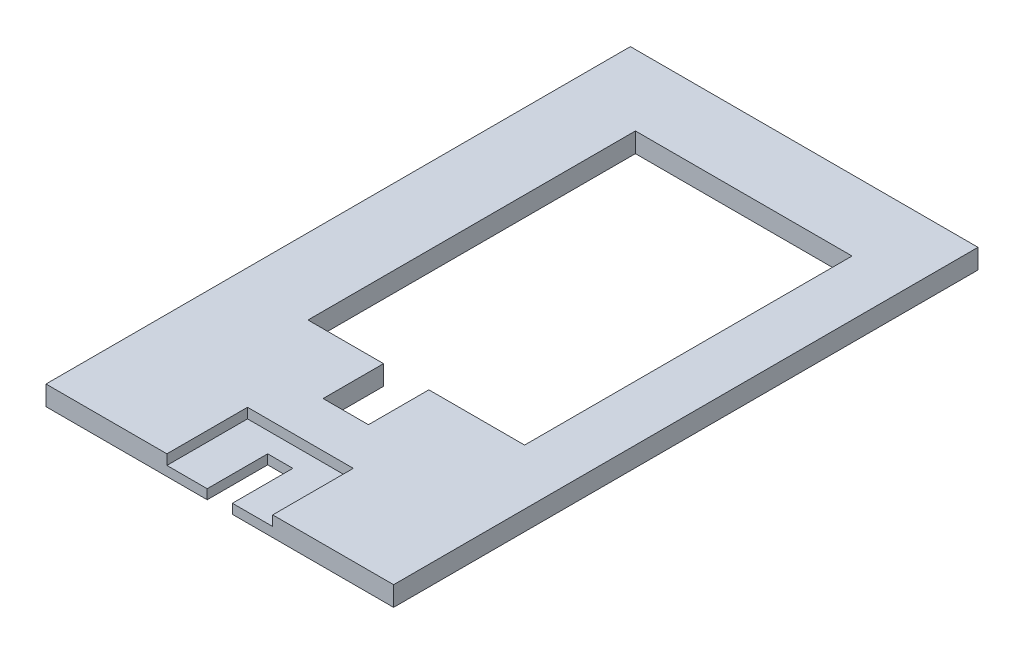
ISO-10303-21;
HEADER;
FILE_DESCRIPTION(('STEP AP214'),'2;1');
FILE_NAME('part.step','',(''),(''),'','','');
FILE_SCHEMA(('AUTOMOTIVE_DESIGN { 1 0 10303 214 1 1 1 1 }'));
ENDSEC;
DATA;
#1=APPLICATION_CONTEXT('core data for automotive mechanical design processes');
#2=APPLICATION_PROTOCOL_DEFINITION('international standard','automotive_design',2000,#1);
#3=PRODUCT_CONTEXT('',#1,'mechanical');
#4=PRODUCT('Part','Part','',(#3));
#5=PRODUCT_RELATED_PRODUCT_CATEGORY('part','',(#4));
#6=PRODUCT_DEFINITION_FORMATION('','',#4);
#7=PRODUCT_DEFINITION_CONTEXT('part definition',#1,'design');
#8=PRODUCT_DEFINITION('design','',#6,#7);
#9=PRODUCT_DEFINITION_SHAPE('','',#8);
#10=(LENGTH_UNIT() NAMED_UNIT(*) SI_UNIT(.MILLI.,.METRE.));
#11=(NAMED_UNIT(*) PLANE_ANGLE_UNIT() SI_UNIT($,.RADIAN.));
#12=(NAMED_UNIT(*) SI_UNIT($,.STERADIAN.) SOLID_ANGLE_UNIT());
#13=UNCERTAINTY_MEASURE_WITH_UNIT(LENGTH_MEASURE(1.E-05),#10,'distance_accuracy_value','');
#14=(GEOMETRIC_REPRESENTATION_CONTEXT(3) GLOBAL_UNCERTAINTY_ASSIGNED_CONTEXT((#13)) GLOBAL_UNIT_ASSIGNED_CONTEXT((#10,
#11,#12)) REPRESENTATION_CONTEXT('',''));
#15=CARTESIAN_POINT('',(0.,0.,0.));
#16=DIRECTION('',(0.,0.,1.));
#17=DIRECTION('',(1.,0.,0.));
#18=AXIS2_PLACEMENT_3D('',#15,#16,#17);
#19=CARTESIAN_POINT('',(187.572815533981,19.53,173.337378640777));
#20=DIRECTION('',(0.,0.,1.));
#21=DIRECTION('',(1.,0.,0.));
#22=AXIS2_PLACEMENT_3D('',#19,#20,#21);
#23=PLANE('',#22);
#24=DIRECTION('',(0.,1.,0.));
#25=VECTOR('',#24,1.);
#26=CARTESIAN_POINT('',(2.57281553398068,-0.469999999999998,173.337378640777));
#27=LINE('',#26,#25);
#28=CARTESIAN_POINT('',(2.57281553398068,0.,173.337378640777));
#29=VERTEX_POINT('',#28);
#30=CARTESIAN_POINT('',(2.57281553398068,9.53,173.337378640777));
#31=VERTEX_POINT('',#30);
#32=EDGE_CURVE('E174',#29,#31,#27,.T.);
#33=ORIENTED_EDGE('',*,*,#32,.T.);
#34=DIRECTION('',(1.,0.,0.));
#35=VECTOR('',#34,1.);
#36=CARTESIAN_POINT('',(-37.4271844660193,9.53,173.337378640777));
#37=LINE('',#36,#35);
#38=CARTESIAN_POINT('',(-37.4271844660193,9.53,173.337378640777));
#39=VERTEX_POINT('',#38);
#40=EDGE_CURVE('E186',#39,#31,#37,.T.);
#41=ORIENTED_EDGE('',*,*,#40,.F.);
#42=DIRECTION('',(0.,1.,0.));
#43=VECTOR('',#42,1.);
#44=CARTESIAN_POINT('',(-37.4271844660193,9.53,173.337378640777));
#45=LINE('',#44,#43);
#46=CARTESIAN_POINT('',(-37.4271844660193,19.53,173.337378640777));
#47=VERTEX_POINT('',#46);
#48=EDGE_CURVE('E202',#39,#47,#45,.T.);
#49=ORIENTED_EDGE('',*,*,#48,.T.);
#50=DIRECTION('',(-1.,0.,0.));
#51=VECTOR('',#50,1.);
#52=CARTESIAN_POINT('',(187.572815533981,19.53,173.337378640777));
#53=LINE('',#52,#51);
#54=CARTESIAN_POINT('',(-157.427184466019,19.53,173.337378640777));
#55=VERTEX_POINT('',#54);
#56=EDGE_CURVE('E290',#47,#55,#53,.T.);
#57=ORIENTED_EDGE('',*,*,#56,.T.);
#58=DIRECTION('',(0.,-1.,0.));
#59=VECTOR('',#58,1.);
#60=CARTESIAN_POINT('',(-157.427184466019,19.53,173.337378640777));
#61=LINE('',#60,#59);
#62=CARTESIAN_POINT('',(-157.427184466019,0.,173.337378640777));
#63=VERTEX_POINT('',#62);
#64=EDGE_CURVE('E306',#55,#63,#61,.T.);
#65=ORIENTED_EDGE('',*,*,#64,.T.);
#66=DIRECTION('',(-1.,0.,0.));
#67=VECTOR('',#66,1.);
#68=CARTESIAN_POINT('',(187.572815533981,0.,173.337378640777));
#69=LINE('',#68,#67);
#70=EDGE_CURVE('E188',#29,#63,#69,.T.);
#71=ORIENTED_EDGE('',*,*,#70,.F.);
#72=EDGE_LOOP('',(#33,#41,#49,#57,#65,#71));
#73=FACE_BOUND('',#72,.T.);
#74=ADVANCED_FACE('F32',(#73),#23,.T.);
#75=CARTESIAN_POINT('',(-82.4271844660193,19.530012,-11.6626213592233));
#76=DIRECTION('',(0.,0.,-1.));
#77=DIRECTION('',(-1.,0.,0.));
#78=AXIS2_PLACEMENT_3D('',#75,#76,#77);
#79=PLANE('',#78);
#80=DIRECTION('',(0.,1.,0.));
#81=VECTOR('',#80,1.);
#82=CARTESIAN_POINT('',(-7.42718446601934,0.,-11.6626213592233));
#83=LINE('',#82,#81);
#84=CARTESIAN_POINT('',(-7.42718446601934,0.,-11.6626213592233));
#85=VERTEX_POINT('',#84);
#86=CARTESIAN_POINT('',(-7.42718446601934,19.53,-11.6626213592233));
#87=VERTEX_POINT('',#86);
#88=EDGE_CURVE('E237',#85,#87,#83,.T.);
#89=ORIENTED_EDGE('',*,*,#88,.F.);
#90=DIRECTION('',(-1.,0.,0.));
#91=VECTOR('',#90,1.);
#92=CARTESIAN_POINT('',(-82.4271844660193,0.,-11.6626213592233));
#93=LINE('',#92,#91);
#94=CARTESIAN_POINT('',(-82.4271844660193,0.,-11.6626213592233));
#95=VERTEX_POINT('',#94);
#96=EDGE_CURVE('E253',#85,#95,#93,.T.);
#97=ORIENTED_EDGE('',*,*,#96,.T.);
#98=DIRECTION('',(0.,-1.,0.));
#99=VECTOR('',#98,1.);
#100=CARTESIAN_POINT('',(-82.4271844660193,19.530012,-11.6626213592233));
#101=LINE('',#100,#99);
#102=CARTESIAN_POINT('',(-82.4271844660193,19.53,-11.6626213592233));
#103=VERTEX_POINT('',#102);
#104=EDGE_CURVE('E264',#103,#95,#101,.T.);
#105=ORIENTED_EDGE('',*,*,#104,.F.);
#106=DIRECTION('',(-1.,0.,0.));
#107=VECTOR('',#106,1.);
#108=CARTESIAN_POINT('',(0.,19.53,-11.6626213592233));
#109=LINE('',#108,#107);
#110=EDGE_CURVE('E273',#87,#103,#109,.T.);
#111=ORIENTED_EDGE('',*,*,#110,.F.);
#112=EDGE_LOOP('',(#89,#97,#105,#111));
#113=FACE_BOUND('',#112,.T.);
#114=ADVANCED_FACE('F372',(#113),#79,.T.);
#115=CARTESIAN_POINT('',(0.,19.53,0.));
#116=DIRECTION('',(0.,1.,0.));
#117=DIRECTION('',(0.,0.,1.));
#118=AXIS2_PLACEMENT_3D('',#115,#116,#117);
#119=PLANE('',#118);
#120=DIRECTION('',(0.,0.,1.));
#121=VECTOR('',#120,1.);
#122=CARTESIAN_POINT('',(-37.4271844660193,19.53,93.3373786407766));
#123=LINE('',#122,#121);
#124=CARTESIAN_POINT('',(-37.4271844660193,19.53,93.3373786407766));
#125=VERTEX_POINT('',#124);
#126=EDGE_CURVE('E203',#125,#47,#123,.T.);
#127=ORIENTED_EDGE('',*,*,#126,.F.);
#128=DIRECTION('',(-1.,0.,0.));
#129=VECTOR('',#128,1.);
#130=CARTESIAN_POINT('',(-37.4271844660193,19.53,93.3373786407766));
#131=LINE('',#130,#129);
#132=CARTESIAN_POINT('',(67.5728155339806,19.53,93.3373786407766));
#133=VERTEX_POINT('',#132);
#134=EDGE_CURVE('E209',#133,#125,#131,.T.);
#135=ORIENTED_EDGE('',*,*,#134,.F.);
#136=DIRECTION('',(0.,0.,-1.));
#137=VECTOR('',#136,1.);
#138=CARTESIAN_POINT('',(67.5728155339806,19.53,93.3373786407766));
#139=LINE('',#138,#137);
#140=CARTESIAN_POINT('',(67.5728155339807,19.53,173.337378640777));
#141=VERTEX_POINT('',#140);
#142=EDGE_CURVE('E205',#141,#133,#139,.T.);
#143=ORIENTED_EDGE('',*,*,#142,.F.);
#144=CARTESIAN_POINT('',(187.572815533981,19.53,173.337378640777));
#145=VERTEX_POINT('',#144);
#146=EDGE_CURVE('E291',#145,#141,#53,.T.);
#147=ORIENTED_EDGE('',*,*,#146,.F.);
#148=DIRECTION('',(0.,0.,-1.));
#149=VECTOR('',#148,1.);
#150=CARTESIAN_POINT('',(187.572815533981,19.53,173.337378640777));
#151=LINE('',#150,#149);
#152=CARTESIAN_POINT('',(187.572815533981,19.53,-406.662621359223));
#153=VERTEX_POINT('',#152);
#154=EDGE_CURVE('E281',#145,#153,#151,.T.);
#155=ORIENTED_EDGE('',*,*,#154,.T.);
#156=DIRECTION('',(-1.,0.,0.));
#157=VECTOR('',#156,1.);
#158=CARTESIAN_POINT('',(187.572815533981,19.53,-406.662621359223));
#159=LINE('',#158,#157);
#160=CARTESIAN_POINT('',(-157.427184466019,19.53,-406.662621359223));
#161=VERTEX_POINT('',#160);
#162=EDGE_CURVE('E284',#153,#161,#159,.T.);
#163=ORIENTED_EDGE('',*,*,#162,.T.);
#164=DIRECTION('',(0.,0.,-1.));
#165=VECTOR('',#164,1.);
#166=CARTESIAN_POINT('',(-157.427184466019,19.53,173.337378640777));
#167=LINE('',#166,#165);
#168=EDGE_CURVE('E287',#55,#161,#167,.T.);
#169=ORIENTED_EDGE('',*,*,#168,.F.);
#170=ORIENTED_EDGE('',*,*,#56,.F.);
#171=EDGE_LOOP('',(#127,#135,#143,#147,#155,#163,#169,#170));
#172=FACE_BOUND('',#171,.T.);
#173=DIRECTION('',(0.,0.,1.));
#174=VECTOR('',#173,1.);
#175=CARTESIAN_POINT('',(-7.42718446601934,19.53,-11.6626213592233));
#176=LINE('',#175,#174);
#177=CARTESIAN_POINT('',(-7.42718446601933,19.53,48.3373786407767));
#178=VERTEX_POINT('',#177);
#179=EDGE_CURVE('E214',#87,#178,#176,.T.);
#180=ORIENTED_EDGE('',*,*,#179,.F.);
#181=ORIENTED_EDGE('',*,*,#110,.T.);
#182=DIRECTION('',(0.,0.,-1.));
#183=VECTOR('',#182,1.);
#184=CARTESIAN_POINT('',(-82.4271844660193,19.53,0.));
#185=LINE('',#184,#183);
#186=CARTESIAN_POINT('',(-82.4271844660193,19.53,-336.662621359223));
#187=VERTEX_POINT('',#186);
#188=EDGE_CURVE('E277',#103,#187,#185,.T.);
#189=ORIENTED_EDGE('',*,*,#188,.T.);
#190=DIRECTION('',(1.,0.,0.));
#191=VECTOR('',#190,1.);
#192=CARTESIAN_POINT('',(0.,19.53,-336.662621359223));
#193=LINE('',#192,#191);
#194=CARTESIAN_POINT('',(132.572815533981,19.53,-336.662621359223));
#195=VERTEX_POINT('',#194);
#196=EDGE_CURVE('E267',#187,#195,#193,.T.);
#197=ORIENTED_EDGE('',*,*,#196,.T.);
#198=DIRECTION('',(0.,0.,1.));
#199=VECTOR('',#198,1.);
#200=CARTESIAN_POINT('',(132.572815533981,19.53,0.));
#201=LINE('',#200,#199);
#202=CARTESIAN_POINT('',(132.572815533981,19.53,-11.6626213592233));
#203=VERTEX_POINT('',#202);
#204=EDGE_CURVE('E270',#195,#203,#201,.T.);
#205=ORIENTED_EDGE('',*,*,#204,.T.);
#206=CARTESIAN_POINT('',(37.5728155339806,19.53,-11.6626213592233));
#207=VERTEX_POINT('',#206);
#208=EDGE_CURVE('E274',#203,#207,#109,.T.);
#209=ORIENTED_EDGE('',*,*,#208,.T.);
#210=DIRECTION('',(0.,0.,-1.));
#211=VECTOR('',#210,1.);
#212=CARTESIAN_POINT('',(37.5728155339806,19.53,-11.6626213592233));
#213=LINE('',#212,#211);
#214=CARTESIAN_POINT('',(37.5728155339807,19.53,48.3373786407767));
#215=VERTEX_POINT('',#214);
#216=EDGE_CURVE('E224',#215,#207,#213,.T.);
#217=ORIENTED_EDGE('',*,*,#216,.F.);
#218=DIRECTION('',(1.,0.,0.));
#219=VECTOR('',#218,1.);
#220=CARTESIAN_POINT('',(-7.42718446601933,19.53,48.3373786407767));
#221=LINE('',#220,#219);
#222=EDGE_CURVE('E233',#178,#215,#221,.T.);
#223=ORIENTED_EDGE('',*,*,#222,.F.);
#224=EDGE_LOOP('',(#180,#181,#189,#197,#205,#209,#217,#223));
#225=FACE_BOUND('',#224,.T.);
#226=ADVANCED_FACE('F323',(#172,#225),#119,.T.);
#227=CARTESIAN_POINT('',(0.,0.,0.));
#228=DIRECTION('',(0.,1.,0.));
#229=DIRECTION('',(0.,0.,1.));
#230=AXIS2_PLACEMENT_3D('',#227,#228,#229);
#231=PLANE('',#230);
#232=ORIENTED_EDGE('',*,*,#96,.F.);
#233=DIRECTION('',(0.,0.,1.));
#234=VECTOR('',#233,1.);
#235=CARTESIAN_POINT('',(-7.42718446601934,0.,-11.6626213592233));
#236=LINE('',#235,#234);
#237=CARTESIAN_POINT('',(-7.42718446601933,0.,48.3373786407767));
#238=VERTEX_POINT('',#237);
#239=EDGE_CURVE('E220',#85,#238,#236,.T.);
#240=ORIENTED_EDGE('',*,*,#239,.T.);
#241=DIRECTION('',(1.,0.,0.));
#242=VECTOR('',#241,1.);
#243=CARTESIAN_POINT('',(-7.42718446601933,0.,48.3373786407767));
#244=LINE('',#243,#242);
#245=CARTESIAN_POINT('',(37.5728155339807,0.,48.3373786407767));
#246=VERTEX_POINT('',#245);
#247=EDGE_CURVE('E223',#238,#246,#244,.T.);
#248=ORIENTED_EDGE('',*,*,#247,.T.);
#249=DIRECTION('',(0.,0.,-1.));
#250=VECTOR('',#249,1.);
#251=CARTESIAN_POINT('',(37.5728155339806,0.,-11.6626213592233));
#252=LINE('',#251,#250);
#253=CARTESIAN_POINT('',(37.5728155339806,0.,-11.6626213592233));
#254=VERTEX_POINT('',#253);
#255=EDGE_CURVE('E227',#246,#254,#252,.T.);
#256=ORIENTED_EDGE('',*,*,#255,.T.);
#257=CARTESIAN_POINT('',(132.572815533981,0.,-11.6626213592233));
#258=VERTEX_POINT('',#257);
#259=EDGE_CURVE('E254',#258,#254,#93,.T.);
#260=ORIENTED_EDGE('',*,*,#259,.F.);
#261=DIRECTION('',(0.,0.,1.));
#262=VECTOR('',#261,1.);
#263=CARTESIAN_POINT('',(132.572815533981,0.,-336.662621359223));
#264=LINE('',#263,#262);
#265=CARTESIAN_POINT('',(132.572815533981,0.,-336.662621359223));
#266=VERTEX_POINT('',#265);
#267=EDGE_CURVE('E239',#266,#258,#264,.T.);
#268=ORIENTED_EDGE('',*,*,#267,.F.);
#269=DIRECTION('',(1.,0.,0.));
#270=VECTOR('',#269,1.);
#271=CARTESIAN_POINT('',(-82.4271844660193,0.,-336.662621359223));
#272=LINE('',#271,#270);
#273=CARTESIAN_POINT('',(-82.4271844660193,0.,-336.662621359223));
#274=VERTEX_POINT('',#273);
#275=EDGE_CURVE('E248',#274,#266,#272,.T.);
#276=ORIENTED_EDGE('',*,*,#275,.F.);
#277=DIRECTION('',(0.,0.,-1.));
#278=VECTOR('',#277,1.);
#279=CARTESIAN_POINT('',(-82.4271844660193,0.,-336.662621359223));
#280=LINE('',#279,#278);
#281=EDGE_CURVE('E251',#95,#274,#280,.T.);
#282=ORIENTED_EDGE('',*,*,#281,.F.);
#283=EDGE_LOOP('',(#232,#240,#248,#256,#260,#268,#276,#282));
#284=FACE_BOUND('',#283,.T.);
#285=DIRECTION('',(-1.,0.,0.));
#286=VECTOR('',#285,1.);
#287=CARTESIAN_POINT('',(0.,0.,113.337378640777));
#288=LINE('',#287,#286);
#289=CARTESIAN_POINT('',(27.5728155339806,0.,113.337378640777));
#290=VERTEX_POINT('',#289);
#291=CARTESIAN_POINT('',(2.57281553398067,0.,113.337378640777));
#292=VERTEX_POINT('',#291);
#293=EDGE_CURVE('E342',#290,#292,#288,.T.);
#294=ORIENTED_EDGE('',*,*,#293,.T.);
#295=DIRECTION('',(0.,0.,1.));
#296=VECTOR('',#295,1.);
#297=CARTESIAN_POINT('',(2.57281553398066,0.,0.));
#298=LINE('',#297,#296);
#299=EDGE_CURVE('E206',#292,#29,#298,.T.);
#300=ORIENTED_EDGE('',*,*,#299,.T.);
#301=ORIENTED_EDGE('',*,*,#70,.T.);
#302=DIRECTION('',(0.,0.,-1.));
#303=VECTOR('',#302,1.);
#304=CARTESIAN_POINT('',(-157.427184466019,0.,173.337378640777));
#305=LINE('',#304,#303);
#306=CARTESIAN_POINT('',(-157.427184466019,0.,-406.662621359223));
#307=VERTEX_POINT('',#306);
#308=EDGE_CURVE('E300',#63,#307,#305,.T.);
#309=ORIENTED_EDGE('',*,*,#308,.T.);
#310=DIRECTION('',(-1.,0.,0.));
#311=VECTOR('',#310,1.);
#312=CARTESIAN_POINT('',(187.572815533981,0.,-406.662621359223));
#313=LINE('',#312,#311);
#314=CARTESIAN_POINT('',(187.572815533981,0.,-406.662621359223));
#315=VERTEX_POINT('',#314);
#316=EDGE_CURVE('E297',#315,#307,#313,.T.);
#317=ORIENTED_EDGE('',*,*,#316,.F.);
#318=DIRECTION('',(0.,0.,-1.));
#319=VECTOR('',#318,1.);
#320=CARTESIAN_POINT('',(187.572815533981,0.,173.337378640777));
#321=LINE('',#320,#319);
#322=CARTESIAN_POINT('',(187.572815533981,0.,173.337378640777));
#323=VERTEX_POINT('',#322);
#324=EDGE_CURVE('E280',#323,#315,#321,.T.);
#325=ORIENTED_EDGE('',*,*,#324,.F.);
#326=CARTESIAN_POINT('',(27.5728155339807,0.,173.337378640777));
#327=VERTEX_POINT('',#326);
#328=EDGE_CURVE('E285',#323,#327,#69,.T.);
#329=ORIENTED_EDGE('',*,*,#328,.T.);
#330=DIRECTION('',(0.,0.,-1.));
#331=VECTOR('',#330,1.);
#332=CARTESIAN_POINT('',(27.5728155339806,0.,0.));
#333=LINE('',#332,#331);
#334=EDGE_CURVE('E340',#327,#290,#333,.T.);
#335=ORIENTED_EDGE('',*,*,#334,.T.);
#336=EDGE_LOOP('',(#294,#300,#301,#309,#317,#325,#329,#335));
#337=FACE_BOUND('',#336,.T.);
#338=ADVANCED_FACE('F319',(#284,#337),#231,.F.);
#339=CARTESIAN_POINT('',(187.572815533981,19.53,173.337378640777));
#340=DIRECTION('',(-1.,0.,0.));
#341=DIRECTION('',(0.,0.,1.));
#342=AXIS2_PLACEMENT_3D('',#339,#340,#341);
#343=PLANE('',#342);
#344=ORIENTED_EDGE('',*,*,#324,.T.);
#345=DIRECTION('',(0.,-1.,0.));
#346=VECTOR('',#345,1.);
#347=CARTESIAN_POINT('',(187.572815533981,19.53,-406.662621359223));
#348=LINE('',#347,#346);
#349=EDGE_CURVE('E11',#153,#315,#348,.T.);
#350=ORIENTED_EDGE('',*,*,#349,.F.);
#351=ORIENTED_EDGE('',*,*,#154,.F.);
#352=DIRECTION('',(0.,-1.,0.));
#353=VECTOR('',#352,1.);
#354=CARTESIAN_POINT('',(187.572815533981,19.53,173.337378640777));
#355=LINE('',#354,#353);
#356=EDGE_CURVE('E294',#145,#323,#355,.T.);
#357=ORIENTED_EDGE('',*,*,#356,.T.);
#358=EDGE_LOOP('',(#344,#350,#351,#357));
#359=FACE_BOUND('',#358,.T.);
#360=ADVANCED_FACE('F34',(#359),#343,.F.);
#361=CARTESIAN_POINT('',(187.572815533981,19.53,-406.662621359223));
#362=DIRECTION('',(0.,0.,1.));
#363=DIRECTION('',(1.,0.,0.));
#364=AXIS2_PLACEMENT_3D('',#361,#362,#363);
#365=PLANE('',#364);
#366=ORIENTED_EDGE('',*,*,#316,.T.);
#367=DIRECTION('',(0.,-1.,0.));
#368=VECTOR('',#367,1.);
#369=CARTESIAN_POINT('',(-157.427184466019,19.53,-406.662621359223));
#370=LINE('',#369,#368);
#371=EDGE_CURVE('E40',#161,#307,#370,.T.);
#372=ORIENTED_EDGE('',*,*,#371,.F.);
#373=ORIENTED_EDGE('',*,*,#162,.F.);
#374=ORIENTED_EDGE('',*,*,#349,.T.);
#375=EDGE_LOOP('',(#366,#372,#373,#374));
#376=FACE_BOUND('',#375,.T.);
#377=ADVANCED_FACE('F314',(#376),#365,.F.);
#378=CARTESIAN_POINT('',(-157.427184466019,19.53,173.337378640777));
#379=DIRECTION('',(-1.,0.,0.));
#380=DIRECTION('',(0.,0.,1.));
#381=AXIS2_PLACEMENT_3D('',#378,#379,#380);
#382=PLANE('',#381);
#383=ORIENTED_EDGE('',*,*,#308,.F.);
#384=ORIENTED_EDGE('',*,*,#64,.F.);
#385=ORIENTED_EDGE('',*,*,#168,.T.);
#386=ORIENTED_EDGE('',*,*,#371,.T.);
#387=EDGE_LOOP('',(#383,#384,#385,#386));
#388=FACE_BOUND('',#387,.T.);
#389=ADVANCED_FACE('F310',(#388),#382,.T.);
#390=DIRECTION('',(0.,1.,0.));
#391=VECTOR('',#390,1.);
#392=CARTESIAN_POINT('',(27.5728155339807,-0.469999999999998,173.337378640777));
#393=LINE('',#392,#391);
#394=CARTESIAN_POINT('',(27.5728155339806,9.53,173.337378640777));
#395=VERTEX_POINT('',#394);
#396=EDGE_CURVE('E47',#327,#395,#393,.T.);
#397=ORIENTED_EDGE('',*,*,#396,.F.);
#398=ORIENTED_EDGE('',*,*,#328,.F.);
#399=ORIENTED_EDGE('',*,*,#356,.F.);
#400=ORIENTED_EDGE('',*,*,#146,.T.);
#401=DIRECTION('',(0.,1.,0.));
#402=VECTOR('',#401,1.);
#403=CARTESIAN_POINT('',(67.5728155339807,9.53,173.337378640777));
#404=LINE('',#403,#402);
#405=CARTESIAN_POINT('',(67.5728155339807,9.53,173.337378640777));
#406=VERTEX_POINT('',#405);
#407=EDGE_CURVE('E217',#406,#141,#404,.T.);
#408=ORIENTED_EDGE('',*,*,#407,.F.);
#409=EDGE_CURVE('E193',#395,#406,#37,.T.);
#410=ORIENTED_EDGE('',*,*,#409,.F.);
#411=EDGE_LOOP('',(#397,#398,#399,#400,#408,#410));
#412=FACE_BOUND('',#411,.T.);
#413=ADVANCED_FACE('F332',(#412),#23,.T.);
#414=CARTESIAN_POINT('',(-82.4271844660193,19.530012,-336.662621359223));
#415=DIRECTION('',(1.,0.,0.));
#416=DIRECTION('',(0.,0.,-1.));
#417=AXIS2_PLACEMENT_3D('',#414,#415,#416);
#418=PLANE('',#417);
#419=ORIENTED_EDGE('',*,*,#104,.T.);
#420=ORIENTED_EDGE('',*,*,#281,.T.);
#421=DIRECTION('',(0.,-1.,0.));
#422=VECTOR('',#421,1.);
#423=CARTESIAN_POINT('',(-82.4271844660193,19.530012,-336.662621359223));
#424=LINE('',#423,#422);
#425=EDGE_CURVE('E257',#187,#274,#424,.T.);
#426=ORIENTED_EDGE('',*,*,#425,.F.);
#427=ORIENTED_EDGE('',*,*,#188,.F.);
#428=EDGE_LOOP('',(#419,#420,#426,#427));
#429=FACE_BOUND('',#428,.T.);
#430=ADVANCED_FACE('F383',(#429),#418,.T.);
#431=DIRECTION('',(0.,1.,0.));
#432=VECTOR('',#431,1.);
#433=CARTESIAN_POINT('',(37.5728155339806,0.,-11.6626213592233));
#434=LINE('',#433,#432);
#435=EDGE_CURVE('E240',#254,#207,#434,.T.);
#436=ORIENTED_EDGE('',*,*,#435,.T.);
#437=ORIENTED_EDGE('',*,*,#208,.F.);
#438=DIRECTION('',(0.,-1.,0.));
#439=VECTOR('',#438,1.);
#440=CARTESIAN_POINT('',(132.572815533981,19.530012,-11.6626213592233));
#441=LINE('',#440,#439);
#442=EDGE_CURVE('E262',#203,#258,#441,.T.);
#443=ORIENTED_EDGE('',*,*,#442,.T.);
#444=ORIENTED_EDGE('',*,*,#259,.T.);
#445=EDGE_LOOP('',(#436,#437,#443,#444));
#446=FACE_BOUND('',#445,.T.);
#447=ADVANCED_FACE('F379',(#446),#79,.T.);
#448=CARTESIAN_POINT('',(132.572815533981,19.530012,-336.662621359223));
#449=DIRECTION('',(-1.,0.,0.));
#450=DIRECTION('',(0.,0.,1.));
#451=AXIS2_PLACEMENT_3D('',#448,#449,#450);
#452=PLANE('',#451);
#453=DIRECTION('',(0.,-1.,0.));
#454=VECTOR('',#453,1.);
#455=CARTESIAN_POINT('',(132.572815533981,19.530012,-336.662621359223));
#456=LINE('',#455,#454);
#457=EDGE_CURVE('E260',#195,#266,#456,.T.);
#458=ORIENTED_EDGE('',*,*,#457,.T.);
#459=ORIENTED_EDGE('',*,*,#267,.T.);
#460=ORIENTED_EDGE('',*,*,#442,.F.);
#461=ORIENTED_EDGE('',*,*,#204,.F.);
#462=EDGE_LOOP('',(#458,#459,#460,#461));
#463=FACE_BOUND('',#462,.T.);
#464=ADVANCED_FACE('F407',(#463),#452,.T.);
#465=CARTESIAN_POINT('',(-82.4271844660193,19.530012,-336.662621359223));
#466=DIRECTION('',(0.,0.,1.));
#467=DIRECTION('',(1.,0.,0.));
#468=AXIS2_PLACEMENT_3D('',#465,#466,#467);
#469=PLANE('',#468);
#470=ORIENTED_EDGE('',*,*,#425,.T.);
#471=ORIENTED_EDGE('',*,*,#275,.T.);
#472=ORIENTED_EDGE('',*,*,#457,.F.);
#473=ORIENTED_EDGE('',*,*,#196,.F.);
#474=EDGE_LOOP('',(#470,#471,#472,#473));
#475=FACE_BOUND('',#474,.T.);
#476=ADVANCED_FACE('F411',(#475),#469,.T.);
#477=CARTESIAN_POINT('',(-7.42718446601934,0.,-11.6626213592233));
#478=DIRECTION('',(-1.,0.,0.));
#479=DIRECTION('',(0.,0.,1.));
#480=AXIS2_PLACEMENT_3D('',#477,#478,#479);
#481=PLANE('',#480);
#482=ORIENTED_EDGE('',*,*,#179,.T.);
#483=DIRECTION('',(0.,1.,0.));
#484=VECTOR('',#483,1.);
#485=CARTESIAN_POINT('',(-7.42718446601933,0.,48.3373786407767));
#486=LINE('',#485,#484);
#487=EDGE_CURVE('E230',#238,#178,#486,.T.);
#488=ORIENTED_EDGE('',*,*,#487,.F.);
#489=ORIENTED_EDGE('',*,*,#239,.F.);
#490=ORIENTED_EDGE('',*,*,#88,.T.);
#491=EDGE_LOOP('',(#482,#488,#489,#490));
#492=FACE_BOUND('',#491,.T.);
#493=ADVANCED_FACE('F415',(#492),#481,.F.);
#494=CARTESIAN_POINT('',(37.5728155339806,0.,-11.6626213592233));
#495=DIRECTION('',(1.,0.,0.));
#496=DIRECTION('',(0.,0.,-1.));
#497=AXIS2_PLACEMENT_3D('',#494,#495,#496);
#498=PLANE('',#497);
#499=ORIENTED_EDGE('',*,*,#216,.T.);
#500=ORIENTED_EDGE('',*,*,#435,.F.);
#501=ORIENTED_EDGE('',*,*,#255,.F.);
#502=DIRECTION('',(0.,1.,0.));
#503=VECTOR('',#502,1.);
#504=CARTESIAN_POINT('',(37.5728155339807,0.,48.3373786407767));
#505=LINE('',#504,#503);
#506=EDGE_CURVE('E243',#246,#215,#505,.T.);
#507=ORIENTED_EDGE('',*,*,#506,.T.);
#508=EDGE_LOOP('',(#499,#500,#501,#507));
#509=FACE_BOUND('',#508,.T.);
#510=ADVANCED_FACE('F366',(#509),#498,.F.);
#511=CARTESIAN_POINT('',(-7.42718446601933,0.,48.3373786407767));
#512=DIRECTION('',(0.,0.,1.));
#513=DIRECTION('',(1.,0.,0.));
#514=AXIS2_PLACEMENT_3D('',#511,#512,#513);
#515=PLANE('',#514);
#516=ORIENTED_EDGE('',*,*,#222,.T.);
#517=ORIENTED_EDGE('',*,*,#506,.F.);
#518=ORIENTED_EDGE('',*,*,#247,.F.);
#519=ORIENTED_EDGE('',*,*,#487,.T.);
#520=EDGE_LOOP('',(#516,#517,#518,#519));
#521=FACE_BOUND('',#520,.T.);
#522=ADVANCED_FACE('F359',(#521),#515,.F.);
#523=CARTESIAN_POINT('',(-37.4271844660193,9.53,93.3373786407766));
#524=DIRECTION('',(-1.,0.,0.));
#525=DIRECTION('',(0.,0.,1.));
#526=AXIS2_PLACEMENT_3D('',#523,#524,#525);
#527=PLANE('',#526);
#528=ORIENTED_EDGE('',*,*,#126,.T.);
#529=ORIENTED_EDGE('',*,*,#48,.F.);
#530=DIRECTION('',(0.,0.,1.));
#531=VECTOR('',#530,1.);
#532=CARTESIAN_POINT('',(-37.4271844660193,9.53,93.3373786407766));
#533=LINE('',#532,#531);
#534=CARTESIAN_POINT('',(-37.4271844660193,9.53,93.3373786407766));
#535=VERTEX_POINT('',#534);
#536=EDGE_CURVE('E55',#535,#39,#533,.T.);
#537=ORIENTED_EDGE('',*,*,#536,.F.);
#538=DIRECTION('',(0.,1.,0.));
#539=VECTOR('',#538,1.);
#540=CARTESIAN_POINT('',(-37.4271844660193,9.53,93.3373786407766));
#541=LINE('',#540,#539);
#542=EDGE_CURVE('E212',#535,#125,#541,.T.);
#543=ORIENTED_EDGE('',*,*,#542,.T.);
#544=EDGE_LOOP('',(#528,#529,#537,#543));
#545=FACE_BOUND('',#544,.T.);
#546=ADVANCED_FACE('F357',(#545),#527,.F.);
#547=CARTESIAN_POINT('',(-37.4271844660193,9.53,93.3373786407766));
#548=DIRECTION('',(0.,0.,-1.));
#549=DIRECTION('',(-1.,0.,0.));
#550=AXIS2_PLACEMENT_3D('',#547,#548,#549);
#551=PLANE('',#550);
#552=ORIENTED_EDGE('',*,*,#134,.T.);
#553=ORIENTED_EDGE('',*,*,#542,.F.);
#554=DIRECTION('',(-1.,0.,0.));
#555=VECTOR('',#554,1.);
#556=CARTESIAN_POINT('',(-37.4271844660193,9.53,93.3373786407766));
#557=LINE('',#556,#555);
#558=CARTESIAN_POINT('',(67.5728155339806,9.53,93.3373786407766));
#559=VERTEX_POINT('',#558);
#560=EDGE_CURVE('E196',#559,#535,#557,.T.);
#561=ORIENTED_EDGE('',*,*,#560,.F.);
#562=DIRECTION('',(0.,1.,0.));
#563=VECTOR('',#562,1.);
#564=CARTESIAN_POINT('',(67.5728155339806,9.53,93.3373786407766));
#565=LINE('',#564,#563);
#566=EDGE_CURVE('E215',#559,#133,#565,.T.);
#567=ORIENTED_EDGE('',*,*,#566,.T.);
#568=EDGE_LOOP('',(#552,#553,#561,#567));
#569=FACE_BOUND('',#568,.T.);
#570=ADVANCED_FACE('F355',(#569),#551,.F.);
#571=CARTESIAN_POINT('',(67.5728155339806,9.53,93.3373786407766));
#572=DIRECTION('',(1.,0.,0.));
#573=DIRECTION('',(0.,0.,-1.));
#574=AXIS2_PLACEMENT_3D('',#571,#572,#573);
#575=PLANE('',#574);
#576=ORIENTED_EDGE('',*,*,#142,.T.);
#577=ORIENTED_EDGE('',*,*,#566,.F.);
#578=DIRECTION('',(0.,0.,-1.));
#579=VECTOR('',#578,1.);
#580=CARTESIAN_POINT('',(67.5728155339806,9.53,93.3373786407766));
#581=LINE('',#580,#579);
#582=EDGE_CURVE('E192',#406,#559,#581,.T.);
#583=ORIENTED_EDGE('',*,*,#582,.F.);
#584=ORIENTED_EDGE('',*,*,#407,.T.);
#585=EDGE_LOOP('',(#576,#577,#583,#584));
#586=FACE_BOUND('',#585,.T.);
#587=ADVANCED_FACE('F352',(#586),#575,.F.);
#588=CARTESIAN_POINT('',(0.,9.53,0.));
#589=DIRECTION('',(0.,1.,0.));
#590=DIRECTION('',(0.,0.,1.));
#591=AXIS2_PLACEMENT_3D('',#588,#589,#590);
#592=PLANE('',#591);
#593=DIRECTION('',(0.,0.,1.));
#594=VECTOR('',#593,1.);
#595=CARTESIAN_POINT('',(2.57281553398067,9.53,113.337378640777));
#596=LINE('',#595,#594);
#597=CARTESIAN_POINT('',(2.57281553398067,9.53,113.337378640777));
#598=VERTEX_POINT('',#597);
#599=EDGE_CURVE('E171',#598,#31,#596,.T.);
#600=ORIENTED_EDGE('',*,*,#599,.F.);
#601=DIRECTION('',(-1.,0.,0.));
#602=VECTOR('',#601,1.);
#603=CARTESIAN_POINT('',(2.57281553398067,9.53,113.337378640777));
#604=LINE('',#603,#602);
#605=CARTESIAN_POINT('',(27.5728155339806,9.53,113.337378640777));
#606=VERTEX_POINT('',#605);
#607=EDGE_CURVE('E189',#606,#598,#604,.T.);
#608=ORIENTED_EDGE('',*,*,#607,.F.);
#609=DIRECTION('',(0.,0.,-1.));
#610=VECTOR('',#609,1.);
#611=CARTESIAN_POINT('',(27.5728155339806,9.53,113.337378640777));
#612=LINE('',#611,#610);
#613=EDGE_CURVE('E180',#395,#606,#612,.T.);
#614=ORIENTED_EDGE('',*,*,#613,.F.);
#615=ORIENTED_EDGE('',*,*,#409,.T.);
#616=ORIENTED_EDGE('',*,*,#582,.T.);
#617=ORIENTED_EDGE('',*,*,#560,.T.);
#618=ORIENTED_EDGE('',*,*,#536,.T.);
#619=ORIENTED_EDGE('',*,*,#40,.T.);
#620=EDGE_LOOP('',(#600,#608,#614,#615,#616,#617,#618,#619));
#621=FACE_BOUND('',#620,.T.);
#622=ADVANCED_FACE('F191',(#621),#592,.T.);
#623=CARTESIAN_POINT('',(2.57281553398067,-0.469999999999998,113.337378640777));
#624=DIRECTION('',(-1.,0.,0.));
#625=DIRECTION('',(0.,0.,1.));
#626=AXIS2_PLACEMENT_3D('',#623,#624,#625);
#627=PLANE('',#626);
#628=DIRECTION('',(0.,1.,0.));
#629=VECTOR('',#628,1.);
#630=CARTESIAN_POINT('',(2.57281553398067,-0.469999999999998,113.337378640777));
#631=LINE('',#630,#629);
#632=EDGE_CURVE('E177',#292,#598,#631,.T.);
#633=ORIENTED_EDGE('',*,*,#632,.T.);
#634=ORIENTED_EDGE('',*,*,#599,.T.);
#635=ORIENTED_EDGE('',*,*,#32,.F.);
#636=ORIENTED_EDGE('',*,*,#299,.F.);
#637=EDGE_LOOP('',(#633,#634,#635,#636));
#638=FACE_BOUND('',#637,.T.);
#639=ADVANCED_FACE('F173',(#638),#627,.F.);
#640=CARTESIAN_POINT('',(2.57281553398067,-0.469999999999998,113.337378640777));
#641=DIRECTION('',(0.,0.,-1.));
#642=DIRECTION('',(-1.,0.,0.));
#643=AXIS2_PLACEMENT_3D('',#640,#641,#642);
#644=PLANE('',#643);
#645=DIRECTION('',(0.,1.,0.));
#646=VECTOR('',#645,1.);
#647=CARTESIAN_POINT('',(27.5728155339806,-0.469999999999998,113.337378640777));
#648=LINE('',#647,#646);
#649=EDGE_CURVE('E335',#290,#606,#648,.T.);
#650=ORIENTED_EDGE('',*,*,#649,.T.);
#651=ORIENTED_EDGE('',*,*,#607,.T.);
#652=ORIENTED_EDGE('',*,*,#632,.F.);
#653=ORIENTED_EDGE('',*,*,#293,.F.);
#654=EDGE_LOOP('',(#650,#651,#652,#653));
#655=FACE_BOUND('',#654,.T.);
#656=ADVANCED_FACE('F345',(#655),#644,.F.);
#657=CARTESIAN_POINT('',(27.5728155339806,-0.469999999999998,113.337378640777));
#658=DIRECTION('',(1.,0.,0.));
#659=DIRECTION('',(0.,0.,-1.));
#660=AXIS2_PLACEMENT_3D('',#657,#658,#659);
#661=PLANE('',#660);
#662=ORIENTED_EDGE('',*,*,#396,.T.);
#663=ORIENTED_EDGE('',*,*,#613,.T.);
#664=ORIENTED_EDGE('',*,*,#649,.F.);
#665=ORIENTED_EDGE('',*,*,#334,.F.);
#666=EDGE_LOOP('',(#662,#663,#664,#665));
#667=FACE_BOUND('',#666,.T.);
#668=ADVANCED_FACE('F346',(#667),#661,.F.);
#669=CLOSED_SHELL('',(#74,#114,#226,#338,#360,#377,#389,#413,#430,#447,#464,#476,#493,#510,#522,
#546,#570,#587,#622,#639,#656,#668));
#670=MANIFOLD_SOLID_BREP('B2',#669);
#671=ADVANCED_BREP_SHAPE_REPRESENTATION('',(#18,#670),#14);
#672=SHAPE_DEFINITION_REPRESENTATION(#9,#671);
ENDSEC;
END-ISO-10303-21;
